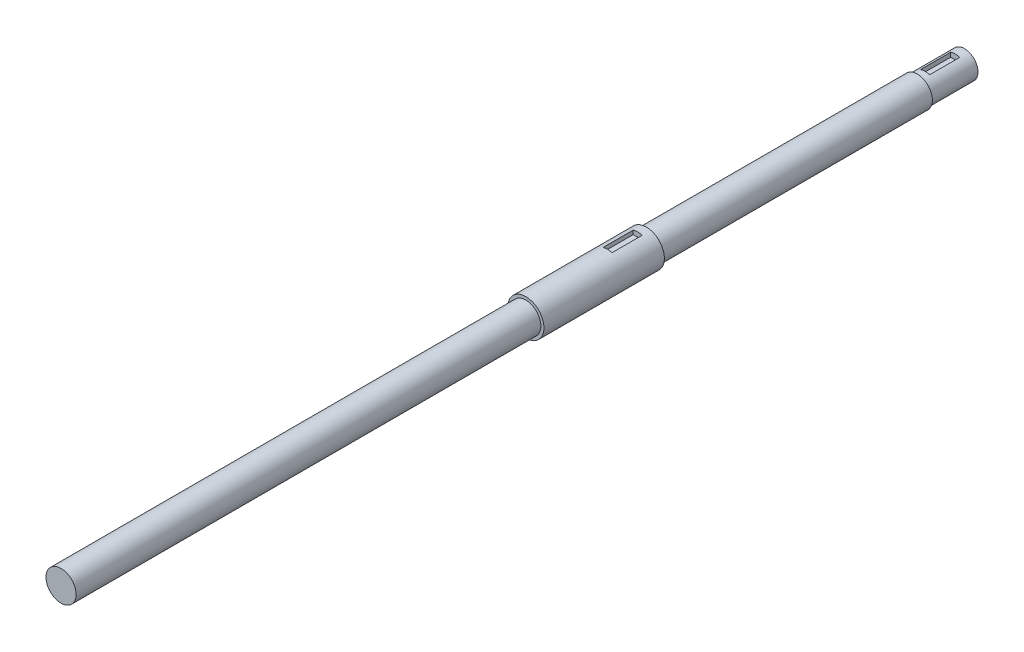
ISO-10303-21;
HEADER;
FILE_DESCRIPTION(('STEP AP214'),'2;1');
FILE_NAME('part.step','',(''),(''),'','','');
FILE_SCHEMA(('AUTOMOTIVE_DESIGN { 1 0 10303 214 1 1 1 1 }'));
ENDSEC;
DATA;
#1=APPLICATION_CONTEXT('core data for automotive mechanical design processes');
#2=APPLICATION_PROTOCOL_DEFINITION('international standard','automotive_design',2000,#1);
#3=PRODUCT_CONTEXT('',#1,'mechanical');
#4=PRODUCT('Part','Part','',(#3));
#5=PRODUCT_RELATED_PRODUCT_CATEGORY('part','',(#4));
#6=PRODUCT_DEFINITION_FORMATION('','',#4);
#7=PRODUCT_DEFINITION_CONTEXT('part definition',#1,'design');
#8=PRODUCT_DEFINITION('design','',#6,#7);
#9=PRODUCT_DEFINITION_SHAPE('','',#8);
#10=(LENGTH_UNIT() NAMED_UNIT(*) SI_UNIT(.MILLI.,.METRE.));
#11=(NAMED_UNIT(*) PLANE_ANGLE_UNIT() SI_UNIT($,.RADIAN.));
#12=(NAMED_UNIT(*) SI_UNIT($,.STERADIAN.) SOLID_ANGLE_UNIT());
#13=UNCERTAINTY_MEASURE_WITH_UNIT(LENGTH_MEASURE(1.E-05),#10,'distance_accuracy_value','');
#14=(GEOMETRIC_REPRESENTATION_CONTEXT(3) GLOBAL_UNCERTAINTY_ASSIGNED_CONTEXT((#13)) GLOBAL_UNIT_ASSIGNED_CONTEXT((#10,
#11,#12)) REPRESENTATION_CONTEXT('',''));
#15=CARTESIAN_POINT('',(0.,0.,0.));
#16=DIRECTION('',(0.,0.,1.));
#17=DIRECTION('',(1.,0.,0.));
#18=AXIS2_PLACEMENT_3D('',#15,#16,#17);
#19=CARTESIAN_POINT('',(0.,0.,134.992104590909));
#20=DIRECTION('',(0.,0.,1.));
#21=DIRECTION('',(1.,0.,0.));
#22=AXIS2_PLACEMENT_3D('',#19,#20,#21);
#23=CYLINDRICAL_SURFACE('',#22,4.5);
#24=CARTESIAN_POINT('',(0.,0.,-165.007895409091));
#25=DIRECTION('',(0.,0.,1.));
#26=DIRECTION('',(1.,0.,0.));
#27=AXIS2_PLACEMENT_3D('',#24,#25,#26);
#28=CIRCLE('',#27,4.5);
#29=CARTESIAN_POINT('',(4.5,0.,-165.007895409091));
#30=VERTEX_POINT('',#29);
#31=EDGE_CURVE('E166',#30,#30,#28,.T.);
#32=ORIENTED_EDGE('',*,*,#31,.T.);
#33=EDGE_LOOP('',(#32));
#34=FACE_BOUND('',#33,.T.);
#35=CARTESIAN_POINT('',(0.,0.,-149.357384882976));
#36=DIRECTION('',(0.,0.,1.));
#37=DIRECTION('',(1.,0.,0.));
#38=AXIS2_PLACEMENT_3D('',#35,#36,#37);
#39=CIRCLE('',#38,4.5);
#40=CARTESIAN_POINT('',(4.5,0.,-149.357384882976));
#41=VERTEX_POINT('',#40);
#42=EDGE_CURVE('E173',#41,#41,#39,.T.);
#43=ORIENTED_EDGE('',*,*,#42,.F.);
#44=EDGE_LOOP('',(#43));
#45=FACE_BOUND('',#44,.T.);
#46=CARTESIAN_POINT('',(0.,0.,-151.934482796253));
#47=DIRECTION('',(0.,0.,1.));
#48=DIRECTION('',(1.,0.,0.));
#49=AXIS2_PLACEMENT_3D('',#46,#47,#48);
#50=CIRCLE('',#49,4.5);
#51=CARTESIAN_POINT('',(1.5,4.24264068711928,-151.934482796253));
#52=VERTEX_POINT('',#51);
#53=CARTESIAN_POINT('',(-1.5,4.24264068711928,-151.934482796253));
#54=VERTEX_POINT('',#53);
#55=EDGE_CURVE('E218',#52,#54,#50,.T.);
#56=ORIENTED_EDGE('',*,*,#55,.T.);
#57=DIRECTION('',(0.,0.,1.));
#58=VECTOR('',#57,1.);
#59=CARTESIAN_POINT('',(-1.5,4.24264068711928,134.992104590909));
#60=LINE('',#59,#58);
#61=CARTESIAN_POINT('',(-1.5,4.24264068711928,-161.934482796253));
#62=VERTEX_POINT('',#61);
#63=EDGE_CURVE('E11',#54,#62,#60,.F.);
#64=ORIENTED_EDGE('',*,*,#63,.T.);
#65=CARTESIAN_POINT('',(0.,0.,-161.934482796253));
#66=DIRECTION('',(0.,0.,-1.));
#67=DIRECTION('',(-1.,0.,0.));
#68=AXIS2_PLACEMENT_3D('',#65,#66,#67);
#69=CIRCLE('',#68,4.5);
#70=CARTESIAN_POINT('',(1.5,4.24264068711928,-161.934482796253));
#71=VERTEX_POINT('',#70);
#72=EDGE_CURVE('E48',#62,#71,#69,.T.);
#73=ORIENTED_EDGE('',*,*,#72,.T.);
#74=DIRECTION('',(0.,0.,1.));
#75=VECTOR('',#74,1.);
#76=CARTESIAN_POINT('',(1.5,4.24264068711928,134.992104590909));
#77=LINE('',#76,#75);
#78=EDGE_CURVE('E215',#52,#71,#77,.F.);
#79=ORIENTED_EDGE('',*,*,#78,.F.);
#80=EDGE_LOOP('',(#56,#64,#73,#79));
#81=FACE_BOUND('',#80,.T.);
#82=ADVANCED_FACE('F39',(#34,#45,#81),#23,.T.);
#83=CARTESIAN_POINT('',(0.,0.,134.992104590909));
#84=DIRECTION('',(0.,0.,1.));
#85=DIRECTION('',(1.,0.,0.));
#86=AXIS2_PLACEMENT_3D('',#83,#84,#85);
#87=CYLINDRICAL_SURFACE('',#86,5.99999999999998);
#88=CARTESIAN_POINT('',(0.,0.,-59.3573848829765));
#89=DIRECTION('',(0.,0.,1.));
#90=DIRECTION('',(1.,0.,0.));
#91=AXIS2_PLACEMENT_3D('',#88,#89,#90);
#92=CIRCLE('',#91,5.99999999999999);
#93=CARTESIAN_POINT('',(5.99999999999999,0.,-59.3573848829765));
#94=VERTEX_POINT('',#93);
#95=EDGE_CURVE('E185',#94,#94,#92,.T.);
#96=ORIENTED_EDGE('',*,*,#95,.T.);
#97=EDGE_LOOP('',(#96));
#98=FACE_BOUND('',#97,.T.);
#99=CARTESIAN_POINT('',(0.,0.,-19.3573848829765));
#100=DIRECTION('',(0.,0.,1.));
#101=DIRECTION('',(1.,0.,0.));
#102=AXIS2_PLACEMENT_3D('',#99,#100,#101);
#103=CIRCLE('',#102,5.99999999999998);
#104=CARTESIAN_POINT('',(5.99999999999998,0.,-19.3573848829765));
#105=VERTEX_POINT('',#104);
#106=EDGE_CURVE('E189',#105,#105,#103,.T.);
#107=ORIENTED_EDGE('',*,*,#106,.F.);
#108=EDGE_LOOP('',(#107));
#109=FACE_BOUND('',#108,.T.);
#110=CARTESIAN_POINT('',(0.,0.,-46.5122426613937));
#111=DIRECTION('',(0.,0.,1.));
#112=DIRECTION('',(1.,0.,0.));
#113=AXIS2_PLACEMENT_3D('',#110,#111,#112);
#114=CIRCLE('',#113,5.99999999999998);
#115=CARTESIAN_POINT('',(1.5,5.80947501931111,-46.5122426613937));
#116=VERTEX_POINT('',#115);
#117=CARTESIAN_POINT('',(-1.5,5.80947501931111,-46.5122426613937));
#118=VERTEX_POINT('',#117);
#119=EDGE_CURVE('E204',#116,#118,#114,.T.);
#120=ORIENTED_EDGE('',*,*,#119,.T.);
#121=DIRECTION('',(0.,0.,1.));
#122=VECTOR('',#121,1.);
#123=CARTESIAN_POINT('',(-1.5,5.80947501931111,134.992104590909));
#124=LINE('',#123,#122);
#125=CARTESIAN_POINT('',(-1.5,5.80947501931111,-56.5122426613937));
#126=VERTEX_POINT('',#125);
#127=EDGE_CURVE('E211',#118,#126,#124,.F.);
#128=ORIENTED_EDGE('',*,*,#127,.T.);
#129=CARTESIAN_POINT('',(0.,0.,-56.5122426613937));
#130=DIRECTION('',(0.,0.,-1.));
#131=DIRECTION('',(-1.,0.,0.));
#132=AXIS2_PLACEMENT_3D('',#129,#130,#131);
#133=CIRCLE('',#132,5.99999999999998);
#134=CARTESIAN_POINT('',(1.5,5.80947501931111,-56.5122426613937));
#135=VERTEX_POINT('',#134);
#136=EDGE_CURVE('E207',#126,#135,#133,.T.);
#137=ORIENTED_EDGE('',*,*,#136,.T.);
#138=DIRECTION('',(0.,0.,1.));
#139=VECTOR('',#138,1.);
#140=CARTESIAN_POINT('',(1.5,5.80947501931111,134.992104590909));
#141=LINE('',#140,#139);
#142=EDGE_CURVE('E201',#116,#135,#141,.F.);
#143=ORIENTED_EDGE('',*,*,#142,.F.);
#144=EDGE_LOOP('',(#120,#128,#137,#143));
#145=FACE_BOUND('',#144,.T.);
#146=ADVANCED_FACE('F238',(#98,#109,#145),#87,.T.);
#147=CARTESIAN_POINT('',(0.,0.,134.992104590909));
#148=DIRECTION('',(0.,0.,-1.));
#149=DIRECTION('',(-1.,0.,0.));
#150=AXIS2_PLACEMENT_3D('',#147,#148,#149);
#151=PLANE('',#150);
#152=CARTESIAN_POINT('',(0.,0.,134.992104590909));
#153=DIRECTION('',(0.,0.,1.));
#154=DIRECTION('',(1.,0.,0.));
#155=AXIS2_PLACEMENT_3D('',#152,#153,#154);
#156=CIRCLE('',#155,5.);
#157=CARTESIAN_POINT('',(5.,0.,134.992104590909));
#158=VERTEX_POINT('',#157);
#159=EDGE_CURVE('E197',#158,#158,#156,.T.);
#160=ORIENTED_EDGE('',*,*,#159,.T.);
#161=EDGE_LOOP('',(#160));
#162=FACE_BOUND('',#161,.T.);
#163=ADVANCED_FACE('F41',(#162),#151,.F.);
#164=CARTESIAN_POINT('',(0.,0.,134.992104590909));
#165=DIRECTION('',(0.,0.,1.));
#166=DIRECTION('',(1.,0.,0.));
#167=AXIS2_PLACEMENT_3D('',#164,#165,#166);
#168=CYLINDRICAL_SURFACE('',#167,4.99999999999999);
#169=ORIENTED_EDGE('',*,*,#159,.F.);
#170=EDGE_LOOP('',(#169));
#171=FACE_BOUND('',#170,.T.);
#172=CARTESIAN_POINT('',(0.,0.,-19.3573848829765));
#173=DIRECTION('',(0.,0.,1.));
#174=DIRECTION('',(1.,0.,0.));
#175=AXIS2_PLACEMENT_3D('',#172,#173,#174);
#176=CIRCLE('',#175,4.99999999999998);
#177=CARTESIAN_POINT('',(4.99999999999998,0.,-19.3573848829765));
#178=VERTEX_POINT('',#177);
#179=EDGE_CURVE('E193',#178,#178,#176,.T.);
#180=ORIENTED_EDGE('',*,*,#179,.T.);
#181=EDGE_LOOP('',(#180));
#182=FACE_BOUND('',#181,.T.);
#183=ADVANCED_FACE('F265',(#171,#182),#168,.T.);
#184=CARTESIAN_POINT('',(0.,5.99999999999998,-19.3573848829765));
#185=DIRECTION('',(0.,0.,-1.));
#186=DIRECTION('',(-1.,0.,0.));
#187=AXIS2_PLACEMENT_3D('',#184,#185,#186);
#188=PLANE('',#187);
#189=ORIENTED_EDGE('',*,*,#179,.F.);
#190=EDGE_LOOP('',(#189));
#191=FACE_BOUND('',#190,.T.);
#192=ORIENTED_EDGE('',*,*,#106,.T.);
#193=EDGE_LOOP('',(#192));
#194=FACE_BOUND('',#193,.T.);
#195=ADVANCED_FACE('F261',(#191,#194),#188,.F.);
#196=CARTESIAN_POINT('',(0.,4.99999999999999,-59.3573848829765));
#197=DIRECTION('',(0.,0.,1.));
#198=DIRECTION('',(1.,0.,0.));
#199=AXIS2_PLACEMENT_3D('',#196,#197,#198);
#200=PLANE('',#199);
#201=ORIENTED_EDGE('',*,*,#95,.F.);
#202=EDGE_LOOP('',(#201));
#203=FACE_BOUND('',#202,.T.);
#204=CARTESIAN_POINT('',(0.,0.,-59.3573848829765));
#205=DIRECTION('',(0.,0.,1.));
#206=DIRECTION('',(1.,0.,0.));
#207=AXIS2_PLACEMENT_3D('',#204,#205,#206);
#208=CIRCLE('',#207,4.99999999999999);
#209=CARTESIAN_POINT('',(4.99999999999999,0.,-59.3573848829765));
#210=VERTEX_POINT('',#209);
#211=EDGE_CURVE('E181',#210,#210,#208,.T.);
#212=ORIENTED_EDGE('',*,*,#211,.T.);
#213=EDGE_LOOP('',(#212));
#214=FACE_BOUND('',#213,.T.);
#215=ADVANCED_FACE('F258',(#203,#214),#200,.F.);
#216=CARTESIAN_POINT('',(0.,0.,134.992104590909));
#217=DIRECTION('',(0.,0.,1.));
#218=DIRECTION('',(1.,0.,0.));
#219=AXIS2_PLACEMENT_3D('',#216,#217,#218);
#220=CYLINDRICAL_SURFACE('',#219,4.99999999999999);
#221=ORIENTED_EDGE('',*,*,#211,.F.);
#222=EDGE_LOOP('',(#221));
#223=FACE_BOUND('',#222,.T.);
#224=CARTESIAN_POINT('',(0.,0.,-149.357384882976));
#225=DIRECTION('',(0.,0.,1.));
#226=DIRECTION('',(1.,0.,0.));
#227=AXIS2_PLACEMENT_3D('',#224,#225,#226);
#228=CIRCLE('',#227,5.);
#229=CARTESIAN_POINT('',(5.,0.,-149.357384882976));
#230=VERTEX_POINT('',#229);
#231=EDGE_CURVE('E177',#230,#230,#228,.T.);
#232=ORIENTED_EDGE('',*,*,#231,.T.);
#233=EDGE_LOOP('',(#232));
#234=FACE_BOUND('',#233,.T.);
#235=ADVANCED_FACE('F254',(#223,#234),#220,.T.);
#236=CARTESIAN_POINT('',(0.,4.5,-149.357384882976));
#237=DIRECTION('',(0.,0.,1.));
#238=DIRECTION('',(1.,0.,0.));
#239=AXIS2_PLACEMENT_3D('',#236,#237,#238);
#240=PLANE('',#239);
#241=ORIENTED_EDGE('',*,*,#231,.F.);
#242=EDGE_LOOP('',(#241));
#243=FACE_BOUND('',#242,.T.);
#244=ORIENTED_EDGE('',*,*,#42,.T.);
#245=EDGE_LOOP('',(#244));
#246=FACE_BOUND('',#245,.T.);
#247=ADVANCED_FACE('F251',(#243,#246),#240,.F.);
#248=CARTESIAN_POINT('',(0.,0.,-165.007895409091));
#249=DIRECTION('',(0.,0.,1.));
#250=DIRECTION('',(1.,0.,0.));
#251=AXIS2_PLACEMENT_3D('',#248,#249,#250);
#252=PLANE('',#251);
#253=ORIENTED_EDGE('',*,*,#31,.F.);
#254=EDGE_LOOP('',(#253));
#255=FACE_BOUND('',#254,.T.);
#256=ADVANCED_FACE('F249',(#255),#252,.F.);
#257=CARTESIAN_POINT('',(-1.5,5.99999999999998,-56.5122426613937));
#258=DIRECTION('',(0.,0.,-1.));
#259=DIRECTION('',(-1.,0.,0.));
#260=AXIS2_PLACEMENT_3D('',#257,#258,#259);
#261=PLANE('',#260);
#262=DIRECTION('',(0.,1.,0.));
#263=VECTOR('',#262,1.);
#264=CARTESIAN_POINT('',(-1.5,5.99999999999998,-56.5122426613937));
#265=LINE('',#264,#263);
#266=CARTESIAN_POINT('',(-1.5,4.49999999999998,-56.5122426613937));
#267=VERTEX_POINT('',#266);
#268=EDGE_CURVE('E142',#267,#126,#265,.T.);
#269=ORIENTED_EDGE('',*,*,#268,.F.);
#270=DIRECTION('',(1.,0.,0.));
#271=VECTOR('',#270,1.);
#272=CARTESIAN_POINT('',(-1.5,4.49999999999998,-56.5122426613937));
#273=LINE('',#272,#271);
#274=CARTESIAN_POINT('',(1.5,4.49999999999998,-56.5122426613937));
#275=VERTEX_POINT('',#274);
#276=EDGE_CURVE('E163',#267,#275,#273,.T.);
#277=ORIENTED_EDGE('',*,*,#276,.T.);
#278=DIRECTION('',(0.,1.,0.));
#279=VECTOR('',#278,1.);
#280=CARTESIAN_POINT('',(1.5,5.99999999999998,-56.5122426613937));
#281=LINE('',#280,#279);
#282=EDGE_CURVE('E140',#275,#135,#281,.T.);
#283=ORIENTED_EDGE('',*,*,#282,.T.);
#284=ORIENTED_EDGE('',*,*,#136,.F.);
#285=EDGE_LOOP('',(#269,#277,#283,#284));
#286=FACE_BOUND('',#285,.T.);
#287=ADVANCED_FACE('F294',(#286),#261,.F.);
#288=CARTESIAN_POINT('',(-1.5,5.99999999999998,-46.5122426613937));
#289=DIRECTION('',(0.,0.,1.));
#290=DIRECTION('',(1.,0.,0.));
#291=AXIS2_PLACEMENT_3D('',#288,#289,#290);
#292=PLANE('',#291);
#293=DIRECTION('',(0.,-1.,0.));
#294=VECTOR('',#293,1.);
#295=CARTESIAN_POINT('',(1.5,5.99999999999998,-46.5122426613937));
#296=LINE('',#295,#294);
#297=CARTESIAN_POINT('',(1.5,4.49999999999998,-46.5122426613937));
#298=VERTEX_POINT('',#297);
#299=EDGE_CURVE('E63',#116,#298,#296,.T.);
#300=ORIENTED_EDGE('',*,*,#299,.T.);
#301=DIRECTION('',(1.,0.,0.));
#302=VECTOR('',#301,1.);
#303=CARTESIAN_POINT('',(-1.5,4.49999999999998,-46.5122426613937));
#304=LINE('',#303,#302);
#305=CARTESIAN_POINT('',(-1.5,4.49999999999998,-46.5122426613937));
#306=VERTEX_POINT('',#305);
#307=EDGE_CURVE('E154',#306,#298,#304,.T.);
#308=ORIENTED_EDGE('',*,*,#307,.F.);
#309=DIRECTION('',(0.,-1.,0.));
#310=VECTOR('',#309,1.);
#311=CARTESIAN_POINT('',(-1.5,5.99999999999998,-46.5122426613937));
#312=LINE('',#311,#310);
#313=EDGE_CURVE('E146',#118,#306,#312,.T.);
#314=ORIENTED_EDGE('',*,*,#313,.F.);
#315=ORIENTED_EDGE('',*,*,#119,.F.);
#316=EDGE_LOOP('',(#300,#308,#314,#315));
#317=FACE_BOUND('',#316,.T.);
#318=ADVANCED_FACE('F288',(#317),#292,.F.);
#319=CARTESIAN_POINT('',(-1.5,0.,0.));
#320=DIRECTION('',(-1.,0.,0.));
#321=DIRECTION('',(0.,0.,1.));
#322=AXIS2_PLACEMENT_3D('',#319,#320,#321);
#323=PLANE('',#322);
#324=ORIENTED_EDGE('',*,*,#313,.T.);
#325=DIRECTION('',(0.,0.,-1.));
#326=VECTOR('',#325,1.);
#327=CARTESIAN_POINT('',(-1.5,4.49999999999998,-56.5122426613937));
#328=LINE('',#327,#326);
#329=EDGE_CURVE('E150',#306,#267,#328,.T.);
#330=ORIENTED_EDGE('',*,*,#329,.T.);
#331=ORIENTED_EDGE('',*,*,#268,.T.);
#332=ORIENTED_EDGE('',*,*,#127,.F.);
#333=EDGE_LOOP('',(#324,#330,#331,#332));
#334=FACE_BOUND('',#333,.T.);
#335=ADVANCED_FACE('F285',(#334),#323,.F.);
#336=CARTESIAN_POINT('',(1.5,0.,0.));
#337=DIRECTION('',(-1.,0.,0.));
#338=DIRECTION('',(0.,0.,1.));
#339=AXIS2_PLACEMENT_3D('',#336,#337,#338);
#340=PLANE('',#339);
#341=ORIENTED_EDGE('',*,*,#142,.T.);
#342=ORIENTED_EDGE('',*,*,#282,.F.);
#343=DIRECTION('',(0.,0.,-1.));
#344=VECTOR('',#343,1.);
#345=CARTESIAN_POINT('',(1.5,4.49999999999998,-56.5122426613937));
#346=LINE('',#345,#344);
#347=EDGE_CURVE('E147',#298,#275,#346,.T.);
#348=ORIENTED_EDGE('',*,*,#347,.F.);
#349=ORIENTED_EDGE('',*,*,#299,.F.);
#350=EDGE_LOOP('',(#341,#342,#348,#349));
#351=FACE_BOUND('',#350,.T.);
#352=ADVANCED_FACE('F295',(#351),#340,.T.);
#353=CARTESIAN_POINT('',(-1.5,4.49999999999998,-56.5122426613937));
#354=DIRECTION('',(0.,-1.,0.));
#355=DIRECTION('',(0.,0.,-1.));
#356=AXIS2_PLACEMENT_3D('',#353,#354,#355);
#357=PLANE('',#356);
#358=ORIENTED_EDGE('',*,*,#347,.T.);
#359=ORIENTED_EDGE('',*,*,#276,.F.);
#360=ORIENTED_EDGE('',*,*,#329,.F.);
#361=ORIENTED_EDGE('',*,*,#307,.T.);
#362=EDGE_LOOP('',(#358,#359,#360,#361));
#363=FACE_BOUND('',#362,.T.);
#364=ADVANCED_FACE('F291',(#363),#357,.F.);
#365=CARTESIAN_POINT('',(-1.5,4.5,-161.934482796253));
#366=DIRECTION('',(0.,0.,-1.));
#367=DIRECTION('',(-1.,0.,0.));
#368=AXIS2_PLACEMENT_3D('',#365,#366,#367);
#369=PLANE('',#368);
#370=DIRECTION('',(0.,1.,0.));
#371=VECTOR('',#370,1.);
#372=CARTESIAN_POINT('',(-1.5,4.5,-161.934482796253));
#373=LINE('',#372,#371);
#374=CARTESIAN_POINT('',(-1.5,2.8,-161.934482796253));
#375=VERTEX_POINT('',#374);
#376=EDGE_CURVE('E114',#375,#62,#373,.T.);
#377=ORIENTED_EDGE('',*,*,#376,.F.);
#378=DIRECTION('',(1.,0.,0.));
#379=VECTOR('',#378,1.);
#380=CARTESIAN_POINT('',(-1.5,2.8,-161.934482796253));
#381=LINE('',#380,#379);
#382=CARTESIAN_POINT('',(1.5,2.8,-161.934482796253));
#383=VERTEX_POINT('',#382);
#384=EDGE_CURVE('E122',#375,#383,#381,.T.);
#385=ORIENTED_EDGE('',*,*,#384,.T.);
#386=DIRECTION('',(0.,1.,0.));
#387=VECTOR('',#386,1.);
#388=CARTESIAN_POINT('',(1.5,4.5,-161.934482796253));
#389=LINE('',#388,#387);
#390=EDGE_CURVE('E130',#383,#71,#389,.T.);
#391=ORIENTED_EDGE('',*,*,#390,.T.);
#392=ORIENTED_EDGE('',*,*,#72,.F.);
#393=EDGE_LOOP('',(#377,#385,#391,#392));
#394=FACE_BOUND('',#393,.T.);
#395=ADVANCED_FACE('F225',(#394),#369,.F.);
#396=CARTESIAN_POINT('',(-1.5,4.5,-151.934482796253));
#397=DIRECTION('',(0.,0.,1.));
#398=DIRECTION('',(1.,0.,0.));
#399=AXIS2_PLACEMENT_3D('',#396,#397,#398);
#400=PLANE('',#399);
#401=DIRECTION('',(0.,-1.,0.));
#402=VECTOR('',#401,1.);
#403=CARTESIAN_POINT('',(1.5,4.5,-151.934482796253));
#404=LINE('',#403,#402);
#405=CARTESIAN_POINT('',(1.5,2.8,-151.934482796253));
#406=VERTEX_POINT('',#405);
#407=EDGE_CURVE('E55',#52,#406,#404,.T.);
#408=ORIENTED_EDGE('',*,*,#407,.T.);
#409=DIRECTION('',(1.,0.,0.));
#410=VECTOR('',#409,1.);
#411=CARTESIAN_POINT('',(-1.5,2.8,-151.934482796253));
#412=LINE('',#411,#410);
#413=CARTESIAN_POINT('',(-1.5,2.8,-151.934482796253));
#414=VERTEX_POINT('',#413);
#415=EDGE_CURVE('E117',#414,#406,#412,.T.);
#416=ORIENTED_EDGE('',*,*,#415,.F.);
#417=DIRECTION('',(0.,-1.,0.));
#418=VECTOR('',#417,1.);
#419=CARTESIAN_POINT('',(-1.5,4.5,-151.934482796253));
#420=LINE('',#419,#418);
#421=EDGE_CURVE('E106',#54,#414,#420,.T.);
#422=ORIENTED_EDGE('',*,*,#421,.F.);
#423=ORIENTED_EDGE('',*,*,#55,.F.);
#424=EDGE_LOOP('',(#408,#416,#422,#423));
#425=FACE_BOUND('',#424,.T.);
#426=ADVANCED_FACE('F118',(#425),#400,.F.);
#427=CARTESIAN_POINT('',(-1.5,0.,0.));
#428=DIRECTION('',(-1.,0.,0.));
#429=DIRECTION('',(0.,0.,1.));
#430=AXIS2_PLACEMENT_3D('',#427,#428,#429);
#431=PLANE('',#430);
#432=ORIENTED_EDGE('',*,*,#421,.T.);
#433=DIRECTION('',(0.,0.,-1.));
#434=VECTOR('',#433,1.);
#435=CARTESIAN_POINT('',(-1.5,2.8,-161.934482796253));
#436=LINE('',#435,#434);
#437=EDGE_CURVE('E111',#414,#375,#436,.T.);
#438=ORIENTED_EDGE('',*,*,#437,.T.);
#439=ORIENTED_EDGE('',*,*,#376,.T.);
#440=ORIENTED_EDGE('',*,*,#63,.F.);
#441=EDGE_LOOP('',(#432,#438,#439,#440));
#442=FACE_BOUND('',#441,.T.);
#443=ADVANCED_FACE('F108',(#442),#431,.F.);
#444=CARTESIAN_POINT('',(1.5,0.,0.));
#445=DIRECTION('',(-1.,0.,0.));
#446=DIRECTION('',(0.,0.,1.));
#447=AXIS2_PLACEMENT_3D('',#444,#445,#446);
#448=PLANE('',#447);
#449=ORIENTED_EDGE('',*,*,#78,.T.);
#450=ORIENTED_EDGE('',*,*,#390,.F.);
#451=DIRECTION('',(0.,0.,-1.));
#452=VECTOR('',#451,1.);
#453=CARTESIAN_POINT('',(1.5,2.8,-161.934482796253));
#454=LINE('',#453,#452);
#455=EDGE_CURVE('E136',#406,#383,#454,.T.);
#456=ORIENTED_EDGE('',*,*,#455,.F.);
#457=ORIENTED_EDGE('',*,*,#407,.F.);
#458=EDGE_LOOP('',(#449,#450,#456,#457));
#459=FACE_BOUND('',#458,.T.);
#460=ADVANCED_FACE('F228',(#459),#448,.T.);
#461=CARTESIAN_POINT('',(-1.5,2.8,-161.934482796253));
#462=DIRECTION('',(0.,-1.,0.));
#463=DIRECTION('',(0.,0.,-1.));
#464=AXIS2_PLACEMENT_3D('',#461,#462,#463);
#465=PLANE('',#464);
#466=ORIENTED_EDGE('',*,*,#455,.T.);
#467=ORIENTED_EDGE('',*,*,#384,.F.);
#468=ORIENTED_EDGE('',*,*,#437,.F.);
#469=ORIENTED_EDGE('',*,*,#415,.T.);
#470=EDGE_LOOP('',(#466,#467,#468,#469));
#471=FACE_BOUND('',#470,.T.);
#472=ADVANCED_FACE('F124',(#471),#465,.F.);
#473=CLOSED_SHELL('',(#82,#146,#163,#183,#195,#215,#235,#247,#256,#287,#318,#335,#352,#364,#395,
#426,#443,#460,#472));
#474=MANIFOLD_SOLID_BREP('B2',#473);
#475=ADVANCED_BREP_SHAPE_REPRESENTATION('',(#18,#474),#14);
#476=SHAPE_DEFINITION_REPRESENTATION(#9,#475);
ENDSEC;
END-ISO-10303-21;
